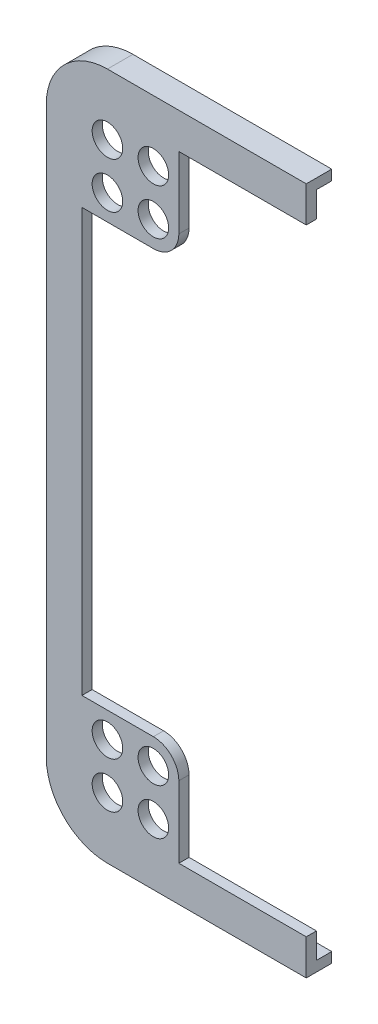
ISO-10303-21;
HEADER;
FILE_DESCRIPTION(('STEP AP214'),'2;1');
FILE_NAME('part.step','',(''),(''),'','','');
FILE_SCHEMA(('AUTOMOTIVE_DESIGN { 1 0 10303 214 1 1 1 1 }'));
ENDSEC;
DATA;
#1=APPLICATION_CONTEXT('core data for automotive mechanical design processes');
#2=APPLICATION_PROTOCOL_DEFINITION('international standard','automotive_design',2000,#1);
#3=PRODUCT_CONTEXT('',#1,'mechanical');
#4=PRODUCT('Part','Part','',(#3));
#5=PRODUCT_RELATED_PRODUCT_CATEGORY('part','',(#4));
#6=PRODUCT_DEFINITION_FORMATION('','',#4);
#7=PRODUCT_DEFINITION_CONTEXT('part definition',#1,'design');
#8=PRODUCT_DEFINITION('design','',#6,#7);
#9=PRODUCT_DEFINITION_SHAPE('','',#8);
#10=(LENGTH_UNIT() NAMED_UNIT(*) SI_UNIT(.MILLI.,.METRE.));
#11=(NAMED_UNIT(*) PLANE_ANGLE_UNIT() SI_UNIT($,.RADIAN.));
#12=(NAMED_UNIT(*) SI_UNIT($,.STERADIAN.) SOLID_ANGLE_UNIT());
#13=UNCERTAINTY_MEASURE_WITH_UNIT(LENGTH_MEASURE(1.E-05),#10,'distance_accuracy_value','');
#14=(GEOMETRIC_REPRESENTATION_CONTEXT(3) GLOBAL_UNCERTAINTY_ASSIGNED_CONTEXT((#13)) GLOBAL_UNIT_ASSIGNED_CONTEXT((#10,
#11,#12)) REPRESENTATION_CONTEXT('',''));
#15=CARTESIAN_POINT('',(0.,0.,0.));
#16=DIRECTION('',(0.,0.,1.));
#17=DIRECTION('',(1.,0.,0.));
#18=AXIS2_PLACEMENT_3D('',#15,#16,#17);
#19=CARTESIAN_POINT('',(0.,0.,0.));
#20=DIRECTION('',(0.,0.,1.));
#21=DIRECTION('',(1.,0.,0.));
#22=AXIS2_PLACEMENT_3D('',#19,#20,#21);
#23=PLANE('',#22);
#24=DIRECTION('',(1.,0.,0.));
#25=VECTOR('',#24,1.);
#26=CARTESIAN_POINT('',(4.41186441001223,3.28637455559292,0.));
#27=LINE('',#26,#25);
#28=CARTESIAN_POINT('',(16.4118644100122,3.28637455559292,0.));
#29=VERTEX_POINT('',#28);
#30=CARTESIAN_POINT('',(55.4222720500978,3.28637455559292,0.));
#31=VERTEX_POINT('',#30);
#32=EDGE_CURVE('E352',#29,#31,#27,.T.);
#33=ORIENTED_EDGE('',*,*,#32,.F.);
#34=CARTESIAN_POINT('',(16.4118644100122,15.2863745555929,0.));
#35=DIRECTION('',(0.,0.,1.));
#36=DIRECTION('',(1.,0.,0.));
#37=AXIS2_PLACEMENT_3D('',#34,#35,#36);
#38=CIRCLE('',#37,12.);
#39=CARTESIAN_POINT('',(4.41186441001222,15.2863745555929,0.));
#40=VERTEX_POINT('',#39);
#41=EDGE_CURVE('E383',#29,#40,#38,.F.);
#42=ORIENTED_EDGE('',*,*,#41,.T.);
#43=DIRECTION('',(0.,-1.,0.));
#44=VECTOR('',#43,1.);
#45=CARTESIAN_POINT('',(4.4118644100122,138.238694525702,0.));
#46=LINE('',#45,#44);
#47=CARTESIAN_POINT('',(4.4118644100122,126.238694525702,0.));
#48=VERTEX_POINT('',#47);
#49=EDGE_CURVE('E330',#48,#40,#46,.T.);
#50=ORIENTED_EDGE('',*,*,#49,.F.);
#51=CARTESIAN_POINT('',(16.4118644100122,126.238694525702,0.));
#52=DIRECTION('',(0.,0.,1.));
#53=DIRECTION('',(1.,0.,0.));
#54=AXIS2_PLACEMENT_3D('',#51,#52,#53);
#55=CIRCLE('',#54,12.);
#56=CARTESIAN_POINT('',(16.4118644100122,138.238694525702,0.));
#57=VERTEX_POINT('',#56);
#58=EDGE_CURVE('E380',#48,#57,#55,.F.);
#59=ORIENTED_EDGE('',*,*,#58,.T.);
#60=DIRECTION('',(-1.,0.,0.));
#61=VECTOR('',#60,1.);
#62=CARTESIAN_POINT('',(4.4118644100122,138.238694525702,0.));
#63=LINE('',#62,#61);
#64=CARTESIAN_POINT('',(55.4222720500978,138.238694525702,0.));
#65=VERTEX_POINT('',#64);
#66=EDGE_CURVE('E336',#65,#57,#63,.T.);
#67=ORIENTED_EDGE('',*,*,#66,.F.);
#68=DIRECTION('',(0.,1.,0.));
#69=VECTOR('',#68,1.);
#70=CARTESIAN_POINT('',(55.4222720500978,138.238694525702,0.));
#71=LINE('',#70,#69);
#72=CARTESIAN_POINT('',(55.4222720500978,136.238694525702,0.));
#73=VERTEX_POINT('',#72);
#74=EDGE_CURVE('E216',#73,#65,#71,.T.);
#75=ORIENTED_EDGE('',*,*,#74,.F.);
#76=DIRECTION('',(1.,0.,0.));
#77=VECTOR('',#76,1.);
#78=CARTESIAN_POINT('',(16.4118644100122,136.238694525702,0.));
#79=LINE('',#78,#77);
#80=CARTESIAN_POINT('',(16.4118644100122,136.238694525702,0.));
#81=VERTEX_POINT('',#80);
#82=EDGE_CURVE('E193',#81,#73,#79,.T.);
#83=ORIENTED_EDGE('',*,*,#82,.F.);
#84=CARTESIAN_POINT('',(16.4118644100122,126.238694525702,0.));
#85=DIRECTION('',(0.,0.,1.));
#86=DIRECTION('',(1.,0.,0.));
#87=AXIS2_PLACEMENT_3D('',#84,#85,#86);
#88=CIRCLE('',#87,10.);
#89=CARTESIAN_POINT('',(6.4118644100122,126.238694525702,0.));
#90=VERTEX_POINT('',#89);
#91=EDGE_CURVE('E200',#81,#90,#88,.T.);
#92=ORIENTED_EDGE('',*,*,#91,.T.);
#93=DIRECTION('',(0.,-1.,0.));
#94=VECTOR('',#93,1.);
#95=CARTESIAN_POINT('',(6.4118644100122,126.238694525702,0.));
#96=LINE('',#95,#94);
#97=CARTESIAN_POINT('',(6.41186441001221,15.286374555593,0.));
#98=VERTEX_POINT('',#97);
#99=EDGE_CURVE('E201',#90,#98,#96,.T.);
#100=ORIENTED_EDGE('',*,*,#99,.T.);
#101=CARTESIAN_POINT('',(16.4118644100122,15.2863745555929,0.));
#102=DIRECTION('',(0.,0.,1.));
#103=DIRECTION('',(1.,0.,0.));
#104=AXIS2_PLACEMENT_3D('',#101,#102,#103);
#105=CIRCLE('',#104,10.);
#106=CARTESIAN_POINT('',(16.4118644100123,5.28637455559292,0.));
#107=VERTEX_POINT('',#106);
#108=EDGE_CURVE('E236',#98,#107,#105,.T.);
#109=ORIENTED_EDGE('',*,*,#108,.T.);
#110=DIRECTION('',(1.,0.,0.));
#111=VECTOR('',#110,1.);
#112=CARTESIAN_POINT('',(16.4118644100123,5.28637455559292,0.));
#113=LINE('',#112,#111);
#114=CARTESIAN_POINT('',(55.4222720500978,5.28637455559292,0.));
#115=VERTEX_POINT('',#114);
#116=EDGE_CURVE('E231',#107,#115,#113,.T.);
#117=ORIENTED_EDGE('',*,*,#116,.T.);
#118=EDGE_CURVE('E355',#31,#115,#71,.T.);
#119=ORIENTED_EDGE('',*,*,#118,.F.);
#120=EDGE_LOOP('',(#33,#42,#50,#59,#67,#75,#83,#92,#100,#109,#117,#119));
#121=FACE_BOUND('',#120,.T.);
#122=ADVANCED_FACE('F40',(#121),#23,.F.);
#123=CARTESIAN_POINT('',(55.4222720500978,138.238694525702,5.));
#124=DIRECTION('',(-1.,0.,0.));
#125=DIRECTION('',(0.,-1.,0.));
#126=AXIS2_PLACEMENT_3D('',#123,#124,#125);
#127=PLANE('',#126);
#128=DIRECTION('',(0.,0.,1.));
#129=VECTOR('',#128,1.);
#130=CARTESIAN_POINT('',(55.4222720500978,131.238694525702,5.));
#131=LINE('',#130,#129);
#132=CARTESIAN_POINT('',(55.4222720500978,131.238694525702,3.));
#133=VERTEX_POINT('',#132);
#134=CARTESIAN_POINT('',(55.4222720500978,131.238694525702,5.));
#135=VERTEX_POINT('',#134);
#136=EDGE_CURVE('E327',#133,#135,#131,.T.);
#137=ORIENTED_EDGE('',*,*,#136,.F.);
#138=DIRECTION('',(0.,1.,0.));
#139=VECTOR('',#138,1.);
#140=CARTESIAN_POINT('',(55.4222720500978,138.238694525702,3.));
#141=LINE('',#140,#139);
#142=CARTESIAN_POINT('',(55.4222720500978,136.238694525702,3.));
#143=VERTEX_POINT('',#142);
#144=EDGE_CURVE('E279',#133,#143,#141,.T.);
#145=ORIENTED_EDGE('',*,*,#144,.T.);
#146=DIRECTION('',(0.,0.,-1.));
#147=VECTOR('',#146,1.);
#148=CARTESIAN_POINT('',(55.4222720500978,136.238694525702,5.));
#149=LINE('',#148,#147);
#150=EDGE_CURVE('E283',#143,#73,#149,.T.);
#151=ORIENTED_EDGE('',*,*,#150,.T.);
#152=ORIENTED_EDGE('',*,*,#74,.T.);
#153=DIRECTION('',(0.,0.,-1.));
#154=VECTOR('',#153,1.);
#155=CARTESIAN_POINT('',(55.4222720500978,138.238694525702,5.));
#156=LINE('',#155,#154);
#157=CARTESIAN_POINT('',(55.4222720500978,138.238694525702,5.));
#158=VERTEX_POINT('',#157);
#159=EDGE_CURVE('E348',#158,#65,#156,.T.);
#160=ORIENTED_EDGE('',*,*,#159,.F.);
#161=DIRECTION('',(0.,1.,0.));
#162=VECTOR('',#161,1.);
#163=CARTESIAN_POINT('',(55.4222720500978,138.238694525702,5.));
#164=LINE('',#163,#162);
#165=EDGE_CURVE('E339',#135,#158,#164,.T.);
#166=ORIENTED_EDGE('',*,*,#165,.F.);
#167=EDGE_LOOP('',(#137,#145,#151,#152,#160,#166));
#168=FACE_BOUND('',#167,.T.);
#169=ADVANCED_FACE('F511',(#168),#127,.F.);
#170=CARTESIAN_POINT('',(0.,0.,5.));
#171=DIRECTION('',(0.,0.,1.));
#172=DIRECTION('',(1.,0.,0.));
#173=AXIS2_PLACEMENT_3D('',#170,#171,#172);
#174=PLANE('',#173);
#175=CARTESIAN_POINT('',(16.4118644100122,117.228286885617,5.));
#176=DIRECTION('',(0.,0.,1.));
#177=DIRECTION('',(1.,0.,0.));
#178=AXIS2_PLACEMENT_3D('',#175,#176,#177);
#179=CIRCLE('',#178,3.);
#180=CARTESIAN_POINT('',(19.4118644100122,117.228286885617,5.));
#181=VERTEX_POINT('',#180);
#182=EDGE_CURVE('E786',#181,#181,#179,.T.);
#183=ORIENTED_EDGE('',*,*,#182,.F.);
#184=EDGE_LOOP('',(#183));
#185=FACE_BOUND('',#184,.T.);
#186=CARTESIAN_POINT('',(16.4118644100122,15.2863745555929,5.));
#187=DIRECTION('',(0.,0.,1.));
#188=DIRECTION('',(1.,0.,0.));
#189=AXIS2_PLACEMENT_3D('',#186,#187,#188);
#190=CIRCLE('',#189,3.);
#191=CARTESIAN_POINT('',(19.4118644100122,15.2863745555929,5.));
#192=VERTEX_POINT('',#191);
#193=EDGE_CURVE('E789',#192,#192,#190,.T.);
#194=ORIENTED_EDGE('',*,*,#193,.F.);
#195=EDGE_LOOP('',(#194));
#196=FACE_BOUND('',#195,.T.);
#197=CARTESIAN_POINT('',(25.4222720500978,15.2863745555929,5.));
#198=DIRECTION('',(0.,0.,1.));
#199=DIRECTION('',(1.,0.,0.));
#200=AXIS2_PLACEMENT_3D('',#197,#198,#199);
#201=CIRCLE('',#200,3.);
#202=CARTESIAN_POINT('',(28.4222720500978,15.2863745555929,5.));
#203=VERTEX_POINT('',#202);
#204=EDGE_CURVE('E778',#203,#203,#201,.T.);
#205=ORIENTED_EDGE('',*,*,#204,.F.);
#206=EDGE_LOOP('',(#205));
#207=FACE_BOUND('',#206,.T.);
#208=CARTESIAN_POINT('',(25.4222720500978,126.238694525702,5.));
#209=DIRECTION('',(0.,0.,1.));
#210=DIRECTION('',(1.,0.,0.));
#211=AXIS2_PLACEMENT_3D('',#208,#209,#210);
#212=CIRCLE('',#211,3.);
#213=CARTESIAN_POINT('',(28.4222720500978,126.238694525702,5.));
#214=VERTEX_POINT('',#213);
#215=EDGE_CURVE('E772',#214,#214,#212,.T.);
#216=ORIENTED_EDGE('',*,*,#215,.F.);
#217=EDGE_LOOP('',(#216));
#218=FACE_BOUND('',#217,.T.);
#219=CARTESIAN_POINT('',(16.4118644100122,126.238694525702,5.));
#220=DIRECTION('',(0.,0.,1.));
#221=DIRECTION('',(1.,0.,0.));
#222=AXIS2_PLACEMENT_3D('',#219,#220,#221);
#223=CIRCLE('',#222,3.);
#224=CARTESIAN_POINT('',(19.4118644100122,126.238694525702,5.));
#225=VERTEX_POINT('',#224);
#226=EDGE_CURVE('E761',#225,#225,#223,.T.);
#227=ORIENTED_EDGE('',*,*,#226,.F.);
#228=EDGE_LOOP('',(#227));
#229=FACE_BOUND('',#228,.T.);
#230=CARTESIAN_POINT('',(16.4118644100122,24.2967821956785,5.));
#231=DIRECTION('',(0.,0.,1.));
#232=DIRECTION('',(1.,0.,0.));
#233=AXIS2_PLACEMENT_3D('',#230,#231,#232);
#234=CIRCLE('',#233,3.);
#235=CARTESIAN_POINT('',(19.4118644100122,24.2967821956785,5.));
#236=VERTEX_POINT('',#235);
#237=EDGE_CURVE('E773',#236,#236,#234,.T.);
#238=ORIENTED_EDGE('',*,*,#237,.F.);
#239=EDGE_LOOP('',(#238));
#240=FACE_BOUND('',#239,.T.);
#241=CARTESIAN_POINT('',(25.4222720500978,24.2967821956785,5.));
#242=DIRECTION('',(0.,0.,1.));
#243=DIRECTION('',(1.,0.,0.));
#244=AXIS2_PLACEMENT_3D('',#241,#242,#243);
#245=CIRCLE('',#244,3.);
#246=CARTESIAN_POINT('',(28.4222720500978,24.2967821956785,5.));
#247=VERTEX_POINT('',#246);
#248=EDGE_CURVE('E780',#247,#247,#245,.T.);
#249=ORIENTED_EDGE('',*,*,#248,.F.);
#250=EDGE_LOOP('',(#249));
#251=FACE_BOUND('',#250,.T.);
#252=CARTESIAN_POINT('',(25.4222720500978,117.228286885617,5.));
#253=DIRECTION('',(0.,0.,1.));
#254=DIRECTION('',(1.,0.,0.));
#255=AXIS2_PLACEMENT_3D('',#252,#253,#254);
#256=CIRCLE('',#255,3.);
#257=CARTESIAN_POINT('',(28.4222720500978,117.228286885617,5.));
#258=VERTEX_POINT('',#257);
#259=EDGE_CURVE('E229',#258,#258,#256,.T.);
#260=ORIENTED_EDGE('',*,*,#259,.F.);
#261=EDGE_LOOP('',(#260));
#262=FACE_BOUND('',#261,.T.);
#263=DIRECTION('',(0.,1.,0.));
#264=VECTOR('',#263,1.);
#265=CARTESIAN_POINT('',(30.4222720500978,0.,5.));
#266=LINE('',#265,#264);
#267=CARTESIAN_POINT('',(30.4222720500978,10.2863745555929,5.));
#268=VERTEX_POINT('',#267);
#269=CARTESIAN_POINT('',(30.4222720500978,24.2967821956785,5.));
#270=VERTEX_POINT('',#269);
#271=EDGE_CURVE('E298',#268,#270,#266,.T.);
#272=ORIENTED_EDGE('',*,*,#271,.T.);
#273=CARTESIAN_POINT('',(25.4222720500978,24.2967821956785,5.));
#274=DIRECTION('',(0.,0.,1.));
#275=DIRECTION('',(1.,0.,0.));
#276=AXIS2_PLACEMENT_3D('',#273,#274,#275);
#277=CIRCLE('',#276,5.);
#278=CARTESIAN_POINT('',(25.4222720500978,29.2967821956785,5.));
#279=VERTEX_POINT('',#278);
#280=EDGE_CURVE('E440',#270,#279,#277,.T.);
#281=ORIENTED_EDGE('',*,*,#280,.T.);
#282=DIRECTION('',(1.,0.,0.));
#283=VECTOR('',#282,1.);
#284=CARTESIAN_POINT('',(0.,29.2967821956785,5.));
#285=LINE('',#284,#283);
#286=CARTESIAN_POINT('',(11.4118644100122,29.2967821956785,5.));
#287=VERTEX_POINT('',#286);
#288=EDGE_CURVE('E294',#287,#279,#285,.T.);
#289=ORIENTED_EDGE('',*,*,#288,.F.);
#290=DIRECTION('',(0.,1.,0.));
#291=VECTOR('',#290,1.);
#292=CARTESIAN_POINT('',(11.4118644100122,0.,5.));
#293=LINE('',#292,#291);
#294=CARTESIAN_POINT('',(11.4118644100122,112.228286885617,5.));
#295=VERTEX_POINT('',#294);
#296=EDGE_CURVE('E290',#287,#295,#293,.T.);
#297=ORIENTED_EDGE('',*,*,#296,.T.);
#298=DIRECTION('',(1.,0.,0.));
#299=VECTOR('',#298,1.);
#300=CARTESIAN_POINT('',(0.,112.228286885617,5.));
#301=LINE('',#300,#299);
#302=CARTESIAN_POINT('',(25.4222720500978,112.228286885617,5.));
#303=VERTEX_POINT('',#302);
#304=EDGE_CURVE('E286',#295,#303,#301,.T.);
#305=ORIENTED_EDGE('',*,*,#304,.T.);
#306=CARTESIAN_POINT('',(25.4222720500978,117.228286885617,5.));
#307=DIRECTION('',(0.,0.,1.));
#308=DIRECTION('',(1.,0.,0.));
#309=AXIS2_PLACEMENT_3D('',#306,#307,#308);
#310=CIRCLE('',#309,5.);
#311=CARTESIAN_POINT('',(30.4222720500978,117.228286885617,5.));
#312=VERTEX_POINT('',#311);
#313=EDGE_CURVE('E437',#303,#312,#310,.T.);
#314=ORIENTED_EDGE('',*,*,#313,.T.);
#315=CARTESIAN_POINT('',(30.4222720500978,131.238694525702,5.));
#316=VERTEX_POINT('',#315);
#317=EDGE_CURVE('E303',#312,#316,#266,.T.);
#318=ORIENTED_EDGE('',*,*,#317,.T.);
#319=DIRECTION('',(1.,0.,0.));
#320=VECTOR('',#319,1.);
#321=CARTESIAN_POINT('',(0.,131.238694525702,5.));
#322=LINE('',#321,#320);
#323=EDGE_CURVE('E307',#316,#135,#322,.T.);
#324=ORIENTED_EDGE('',*,*,#323,.T.);
#325=ORIENTED_EDGE('',*,*,#165,.T.);
#326=DIRECTION('',(-1.,0.,0.));
#327=VECTOR('',#326,1.);
#328=CARTESIAN_POINT('',(4.4118644100122,138.238694525702,5.));
#329=LINE('',#328,#327);
#330=CARTESIAN_POINT('',(16.4118644100122,138.238694525702,5.));
#331=VERTEX_POINT('',#330);
#332=EDGE_CURVE('E344',#158,#331,#329,.T.);
#333=ORIENTED_EDGE('',*,*,#332,.T.);
#334=CARTESIAN_POINT('',(16.4118644100122,126.238694525702,5.));
#335=DIRECTION('',(0.,0.,1.));
#336=DIRECTION('',(1.,0.,0.));
#337=AXIS2_PLACEMENT_3D('',#334,#335,#336);
#338=CIRCLE('',#337,12.);
#339=CARTESIAN_POINT('',(4.4118644100122,126.238694525702,5.));
#340=VERTEX_POINT('',#339);
#341=EDGE_CURVE('E393',#331,#340,#338,.T.);
#342=ORIENTED_EDGE('',*,*,#341,.T.);
#343=DIRECTION('',(0.,-1.,0.));
#344=VECTOR('',#343,1.);
#345=CARTESIAN_POINT('',(4.4118644100122,138.238694525702,5.));
#346=LINE('',#345,#344);
#347=CARTESIAN_POINT('',(4.41186441001222,15.2863745555929,5.));
#348=VERTEX_POINT('',#347);
#349=EDGE_CURVE('E331',#340,#348,#346,.T.);
#350=ORIENTED_EDGE('',*,*,#349,.T.);
#351=CARTESIAN_POINT('',(16.4118644100122,15.2863745555929,5.));
#352=DIRECTION('',(0.,0.,1.));
#353=DIRECTION('',(1.,0.,0.));
#354=AXIS2_PLACEMENT_3D('',#351,#352,#353);
#355=CIRCLE('',#354,12.);
#356=CARTESIAN_POINT('',(16.4118644100122,3.28637455559292,5.));
#357=VERTEX_POINT('',#356);
#358=EDGE_CURVE('E396',#348,#357,#355,.T.);
#359=ORIENTED_EDGE('',*,*,#358,.T.);
#360=DIRECTION('',(1.,0.,0.));
#361=VECTOR('',#360,1.);
#362=CARTESIAN_POINT('',(4.41186441001223,3.28637455559292,5.));
#363=LINE('',#362,#361);
#364=CARTESIAN_POINT('',(55.4222720500978,3.28637455559292,5.));
#365=VERTEX_POINT('',#364);
#366=EDGE_CURVE('E335',#357,#365,#363,.T.);
#367=ORIENTED_EDGE('',*,*,#366,.T.);
#368=CARTESIAN_POINT('',(55.4222720500978,10.286374555593,5.));
#369=VERTEX_POINT('',#368);
#370=EDGE_CURVE('E340',#365,#369,#164,.T.);
#371=ORIENTED_EDGE('',*,*,#370,.T.);
#372=DIRECTION('',(1.,0.,0.));
#373=VECTOR('',#372,1.);
#374=CARTESIAN_POINT('',(0.,10.2863745555929,5.));
#375=LINE('',#374,#373);
#376=EDGE_CURVE('E302',#268,#369,#375,.T.);
#377=ORIENTED_EDGE('',*,*,#376,.F.);
#378=EDGE_LOOP('',(#272,#281,#289,#297,#305,#314,#318,#324,#325,#333,#342,#350,#359,#367,#371,#377));
#379=FACE_BOUND('',#378,.T.);
#380=ADVANCED_FACE('F459',(#185,#196,#207,#218,#229,#240,#251,#262,#379),#174,.T.);
#381=CARTESIAN_POINT('',(4.4118644100122,138.238694525702,5.));
#382=DIRECTION('',(1.,0.,0.));
#383=DIRECTION('',(0.,1.,0.));
#384=AXIS2_PLACEMENT_3D('',#381,#382,#383);
#385=PLANE('',#384);
#386=ORIENTED_EDGE('',*,*,#49,.T.);
#387=DIRECTION('',(0.,0.,-1.));
#388=VECTOR('',#387,1.);
#389=CARTESIAN_POINT('',(4.41186441001222,15.2863745555929,5.));
#390=LINE('',#389,#388);
#391=EDGE_CURVE('E390',#40,#348,#390,.F.);
#392=ORIENTED_EDGE('',*,*,#391,.T.);
#393=ORIENTED_EDGE('',*,*,#349,.F.);
#394=DIRECTION('',(0.,0.,-1.));
#395=VECTOR('',#394,1.);
#396=CARTESIAN_POINT('',(4.4118644100122,126.238694525702,5.));
#397=LINE('',#396,#395);
#398=EDGE_CURVE('E386',#340,#48,#397,.T.);
#399=ORIENTED_EDGE('',*,*,#398,.T.);
#400=EDGE_LOOP('',(#386,#392,#393,#399));
#401=FACE_BOUND('',#400,.T.);
#402=ADVANCED_FACE('F529',(#401),#385,.F.);
#403=CARTESIAN_POINT('',(4.41186441001223,3.28637455559292,5.));
#404=DIRECTION('',(0.,1.,0.));
#405=DIRECTION('',(0.,0.,1.));
#406=AXIS2_PLACEMENT_3D('',#403,#404,#405);
#407=PLANE('',#406);
#408=ORIENTED_EDGE('',*,*,#366,.F.);
#409=DIRECTION('',(0.,0.,-1.));
#410=VECTOR('',#409,1.);
#411=CARTESIAN_POINT('',(16.4118644100122,3.28637455559292,5.));
#412=LINE('',#411,#410);
#413=EDGE_CURVE('E376',#357,#29,#412,.T.);
#414=ORIENTED_EDGE('',*,*,#413,.T.);
#415=ORIENTED_EDGE('',*,*,#32,.T.);
#416=DIRECTION('',(0.,0.,-1.));
#417=VECTOR('',#416,1.);
#418=CARTESIAN_POINT('',(55.4222720500978,3.28637455559292,5.));
#419=LINE('',#418,#417);
#420=EDGE_CURVE('E365',#365,#31,#419,.T.);
#421=ORIENTED_EDGE('',*,*,#420,.F.);
#422=EDGE_LOOP('',(#408,#414,#415,#421));
#423=FACE_BOUND('',#422,.T.);
#424=ADVANCED_FACE('F526',(#423),#407,.F.);
#425=DIRECTION('',(0.,0.,-1.));
#426=VECTOR('',#425,1.);
#427=CARTESIAN_POINT('',(55.4222720500978,5.28637455559292,5.));
#428=LINE('',#427,#426);
#429=CARTESIAN_POINT('',(55.4222720500978,5.28637455559292,3.));
#430=VERTEX_POINT('',#429);
#431=EDGE_CURVE('E373',#430,#115,#428,.T.);
#432=ORIENTED_EDGE('',*,*,#431,.F.);
#433=DIRECTION('',(0.,1.,0.));
#434=VECTOR('',#433,1.);
#435=CARTESIAN_POINT('',(55.4222720500978,138.238694525702,3.));
#436=LINE('',#435,#434);
#437=CARTESIAN_POINT('',(55.4222720500978,10.286374555593,3.));
#438=VERTEX_POINT('',#437);
#439=EDGE_CURVE('E269',#430,#438,#436,.T.);
#440=ORIENTED_EDGE('',*,*,#439,.T.);
#441=DIRECTION('',(0.,0.,1.));
#442=VECTOR('',#441,1.);
#443=CARTESIAN_POINT('',(55.4222720500978,10.286374555593,5.));
#444=LINE('',#443,#442);
#445=EDGE_CURVE('E315',#438,#369,#444,.T.);
#446=ORIENTED_EDGE('',*,*,#445,.T.);
#447=ORIENTED_EDGE('',*,*,#370,.F.);
#448=ORIENTED_EDGE('',*,*,#420,.T.);
#449=ORIENTED_EDGE('',*,*,#118,.T.);
#450=EDGE_LOOP('',(#432,#440,#446,#447,#448,#449));
#451=FACE_BOUND('',#450,.T.);
#452=ADVANCED_FACE('F487',(#451),#127,.F.);
#453=CARTESIAN_POINT('',(4.4118644100122,138.238694525702,5.));
#454=DIRECTION('',(0.,-1.,0.));
#455=DIRECTION('',(0.,0.,-1.));
#456=AXIS2_PLACEMENT_3D('',#453,#454,#455);
#457=PLANE('',#456);
#458=ORIENTED_EDGE('',*,*,#66,.T.);
#459=DIRECTION('',(0.,0.,-1.));
#460=VECTOR('',#459,1.);
#461=CARTESIAN_POINT('',(16.4118644100122,138.238694525702,5.));
#462=LINE('',#461,#460);
#463=EDGE_CURVE('E399',#57,#331,#462,.F.);
#464=ORIENTED_EDGE('',*,*,#463,.T.);
#465=ORIENTED_EDGE('',*,*,#332,.F.);
#466=ORIENTED_EDGE('',*,*,#159,.T.);
#467=EDGE_LOOP('',(#458,#464,#465,#466));
#468=FACE_BOUND('',#467,.T.);
#469=ADVANCED_FACE('F521',(#468),#457,.F.);
#470=CARTESIAN_POINT('',(0.,112.228286885617,-2.));
#471=DIRECTION('',(0.,-1.,0.));
#472=DIRECTION('',(1.,0.,0.));
#473=AXIS2_PLACEMENT_3D('',#470,#471,#472);
#474=PLANE('',#473);
#475=DIRECTION('',(-1.,0.,0.));
#476=VECTOR('',#475,1.);
#477=CARTESIAN_POINT('',(0.,112.228286885617,3.));
#478=LINE('',#477,#476);
#479=CARTESIAN_POINT('',(25.4222720500978,112.228286885617,3.));
#480=VERTEX_POINT('',#479);
#481=CARTESIAN_POINT('',(11.4118644100122,112.228286885617,3.));
#482=VERTEX_POINT('',#481);
#483=EDGE_CURVE('E266',#480,#482,#478,.T.);
#484=ORIENTED_EDGE('',*,*,#483,.F.);
#485=DIRECTION('',(0.,0.,1.));
#486=VECTOR('',#485,1.);
#487=CARTESIAN_POINT('',(25.4222720500978,112.228286885617,-2.));
#488=LINE('',#487,#486);
#489=EDGE_CURVE('E49',#480,#303,#488,.T.);
#490=ORIENTED_EDGE('',*,*,#489,.T.);
#491=ORIENTED_EDGE('',*,*,#304,.F.);
#492=DIRECTION('',(0.,0.,1.));
#493=VECTOR('',#492,1.);
#494=CARTESIAN_POINT('',(11.4118644100122,112.228286885617,-2.));
#495=LINE('',#494,#493);
#496=EDGE_CURVE('E322',#482,#295,#495,.T.);
#497=ORIENTED_EDGE('',*,*,#496,.F.);
#498=EDGE_LOOP('',(#484,#490,#491,#497));
#499=FACE_BOUND('',#498,.T.);
#500=ADVANCED_FACE('F455',(#499),#474,.T.);
#501=CARTESIAN_POINT('',(30.4222720500978,0.,-2.));
#502=DIRECTION('',(1.,0.,0.));
#503=DIRECTION('',(0.,0.,-1.));
#504=AXIS2_PLACEMENT_3D('',#501,#502,#503);
#505=PLANE('',#504);
#506=ORIENTED_EDGE('',*,*,#317,.F.);
#507=DIRECTION('',(0.,0.,1.));
#508=VECTOR('',#507,1.);
#509=CARTESIAN_POINT('',(30.4222720500978,117.228286885617,-2.));
#510=LINE('',#509,#508);
#511=CARTESIAN_POINT('',(30.4222720500978,117.228286885617,3.));
#512=VERTEX_POINT('',#511);
#513=EDGE_CURVE('E12',#312,#512,#510,.F.);
#514=ORIENTED_EDGE('',*,*,#513,.T.);
#515=DIRECTION('',(0.,-1.,0.));
#516=VECTOR('',#515,1.);
#517=CARTESIAN_POINT('',(30.4222720500978,0.,3.));
#518=LINE('',#517,#516);
#519=CARTESIAN_POINT('',(30.4222720500978,131.238694525702,3.));
#520=VERTEX_POINT('',#519);
#521=EDGE_CURVE('E273',#520,#512,#518,.T.);
#522=ORIENTED_EDGE('',*,*,#521,.F.);
#523=DIRECTION('',(0.,0.,1.));
#524=VECTOR('',#523,1.);
#525=CARTESIAN_POINT('',(30.4222720500978,131.238694525702,-2.));
#526=LINE('',#525,#524);
#527=EDGE_CURVE('E311',#520,#316,#526,.T.);
#528=ORIENTED_EDGE('',*,*,#527,.T.);
#529=EDGE_LOOP('',(#506,#514,#522,#528));
#530=FACE_BOUND('',#529,.T.);
#531=ADVANCED_FACE('F594',(#530),#505,.T.);
#532=CARTESIAN_POINT('',(0.,131.238694525702,-2.));
#533=DIRECTION('',(0.,-1.,0.));
#534=DIRECTION('',(0.,0.,-1.));
#535=AXIS2_PLACEMENT_3D('',#532,#533,#534);
#536=PLANE('',#535);
#537=DIRECTION('',(-1.,0.,0.));
#538=VECTOR('',#537,1.);
#539=CARTESIAN_POINT('',(0.,131.238694525702,3.));
#540=LINE('',#539,#538);
#541=EDGE_CURVE('E276',#133,#520,#540,.T.);
#542=ORIENTED_EDGE('',*,*,#541,.F.);
#543=ORIENTED_EDGE('',*,*,#136,.T.);
#544=ORIENTED_EDGE('',*,*,#323,.F.);
#545=ORIENTED_EDGE('',*,*,#527,.F.);
#546=EDGE_LOOP('',(#542,#543,#544,#545));
#547=FACE_BOUND('',#546,.T.);
#548=ADVANCED_FACE('F597',(#547),#536,.T.);
#549=CARTESIAN_POINT('',(0.,10.2863745555929,-2.));
#550=DIRECTION('',(0.,-1.,0.));
#551=DIRECTION('',(1.,0.,0.));
#552=AXIS2_PLACEMENT_3D('',#549,#550,#551);
#553=PLANE('',#552);
#554=ORIENTED_EDGE('',*,*,#445,.F.);
#555=DIRECTION('',(-1.,0.,0.));
#556=VECTOR('',#555,1.);
#557=CARTESIAN_POINT('',(0.,10.2863745555929,3.));
#558=LINE('',#557,#556);
#559=CARTESIAN_POINT('',(30.4222720500978,10.2863745555929,3.));
#560=VERTEX_POINT('',#559);
#561=EDGE_CURVE('E262',#438,#560,#558,.T.);
#562=ORIENTED_EDGE('',*,*,#561,.T.);
#563=DIRECTION('',(0.,0.,1.));
#564=VECTOR('',#563,1.);
#565=CARTESIAN_POINT('',(30.4222720500978,10.2863745555929,-2.));
#566=LINE('',#565,#564);
#567=EDGE_CURVE('E316',#560,#268,#566,.T.);
#568=ORIENTED_EDGE('',*,*,#567,.T.);
#569=ORIENTED_EDGE('',*,*,#376,.T.);
#570=EDGE_LOOP('',(#554,#562,#568,#569));
#571=FACE_BOUND('',#570,.T.);
#572=ADVANCED_FACE('F483',(#571),#553,.F.);
#573=DIRECTION('',(0.,-1.,0.));
#574=VECTOR('',#573,1.);
#575=CARTESIAN_POINT('',(30.4222720500978,0.,3.));
#576=LINE('',#575,#574);
#577=CARTESIAN_POINT('',(30.4222720500978,24.2967821956785,3.));
#578=VERTEX_POINT('',#577);
#579=EDGE_CURVE('E259',#578,#560,#576,.T.);
#580=ORIENTED_EDGE('',*,*,#579,.F.);
#581=DIRECTION('',(0.,0.,1.));
#582=VECTOR('',#581,1.);
#583=CARTESIAN_POINT('',(30.4222720500978,24.2967821956785,5.));
#584=LINE('',#583,#582);
#585=EDGE_CURVE('E402',#578,#270,#584,.T.);
#586=ORIENTED_EDGE('',*,*,#585,.T.);
#587=ORIENTED_EDGE('',*,*,#271,.F.);
#588=ORIENTED_EDGE('',*,*,#567,.F.);
#589=EDGE_LOOP('',(#580,#586,#587,#588));
#590=FACE_BOUND('',#589,.T.);
#591=ADVANCED_FACE('F477',(#590),#505,.T.);
#592=CARTESIAN_POINT('',(0.,29.2967821956785,-2.));
#593=DIRECTION('',(0.,-1.,0.));
#594=DIRECTION('',(1.,0.,0.));
#595=AXIS2_PLACEMENT_3D('',#592,#593,#594);
#596=PLANE('',#595);
#597=ORIENTED_EDGE('',*,*,#288,.T.);
#598=DIRECTION('',(0.,0.,1.));
#599=VECTOR('',#598,1.);
#600=CARTESIAN_POINT('',(25.4222720500978,29.2967821956785,3.));
#601=LINE('',#600,#599);
#602=CARTESIAN_POINT('',(25.4222720500978,29.2967821956785,3.));
#603=VERTEX_POINT('',#602);
#604=EDGE_CURVE('E443',#279,#603,#601,.F.);
#605=ORIENTED_EDGE('',*,*,#604,.T.);
#606=DIRECTION('',(-1.,0.,0.));
#607=VECTOR('',#606,1.);
#608=CARTESIAN_POINT('',(0.,29.2967821956785,3.));
#609=LINE('',#608,#607);
#610=CARTESIAN_POINT('',(11.4118644100122,29.2967821956785,3.));
#611=VERTEX_POINT('',#610);
#612=EDGE_CURVE('E211',#603,#611,#609,.T.);
#613=ORIENTED_EDGE('',*,*,#612,.T.);
#614=DIRECTION('',(0.,0.,1.));
#615=VECTOR('',#614,1.);
#616=CARTESIAN_POINT('',(11.4118644100122,29.2967821956785,-2.));
#617=LINE('',#616,#615);
#618=EDGE_CURVE('E319',#611,#287,#617,.T.);
#619=ORIENTED_EDGE('',*,*,#618,.T.);
#620=EDGE_LOOP('',(#597,#605,#613,#619));
#621=FACE_BOUND('',#620,.T.);
#622=ADVANCED_FACE('F603',(#621),#596,.F.);
#623=CARTESIAN_POINT('',(11.4118644100122,0.,-2.));
#624=DIRECTION('',(1.,0.,0.));
#625=DIRECTION('',(0.,0.,-1.));
#626=AXIS2_PLACEMENT_3D('',#623,#624,#625);
#627=PLANE('',#626);
#628=DIRECTION('',(0.,-1.,0.));
#629=VECTOR('',#628,1.);
#630=CARTESIAN_POINT('',(11.4118644100122,0.,3.));
#631=LINE('',#630,#629);
#632=EDGE_CURVE('E369',#482,#611,#631,.T.);
#633=ORIENTED_EDGE('',*,*,#632,.F.);
#634=ORIENTED_EDGE('',*,*,#496,.T.);
#635=ORIENTED_EDGE('',*,*,#296,.F.);
#636=ORIENTED_EDGE('',*,*,#618,.F.);
#637=EDGE_LOOP('',(#633,#634,#635,#636));
#638=FACE_BOUND('',#637,.T.);
#639=ADVANCED_FACE('F465',(#638),#627,.T.);
#640=CARTESIAN_POINT('',(16.4118644100122,136.238694525702,303.064310096041));
#641=DIRECTION('',(0.,1.,0.));
#642=DIRECTION('',(0.,0.,1.));
#643=AXIS2_PLACEMENT_3D('',#640,#641,#642);
#644=PLANE('',#643);
#645=DIRECTION('',(1.,0.,0.));
#646=VECTOR('',#645,1.);
#647=CARTESIAN_POINT('',(16.4118644100122,136.238694525702,3.));
#648=LINE('',#647,#646);
#649=CARTESIAN_POINT('',(16.4118644100122,136.238694525702,3.));
#650=VERTEX_POINT('',#649);
#651=EDGE_CURVE('E196',#650,#143,#648,.T.);
#652=ORIENTED_EDGE('',*,*,#651,.F.);
#653=DIRECTION('',(0.,0.,-1.));
#654=VECTOR('',#653,1.);
#655=CARTESIAN_POINT('',(16.4118644100122,136.238694525702,303.064310096041));
#656=LINE('',#655,#654);
#657=EDGE_CURVE('E189',#650,#81,#656,.T.);
#658=ORIENTED_EDGE('',*,*,#657,.T.);
#659=ORIENTED_EDGE('',*,*,#82,.T.);
#660=ORIENTED_EDGE('',*,*,#150,.F.);
#661=EDGE_LOOP('',(#652,#658,#659,#660));
#662=FACE_BOUND('',#661,.T.);
#663=ADVANCED_FACE('F191',(#662),#644,.F.);
#664=CARTESIAN_POINT('',(16.4118644100123,5.28637455559292,303.064310096041));
#665=DIRECTION('',(0.,1.,0.));
#666=DIRECTION('',(0.,0.,1.));
#667=AXIS2_PLACEMENT_3D('',#664,#665,#666);
#668=PLANE('',#667);
#669=ORIENTED_EDGE('',*,*,#431,.T.);
#670=ORIENTED_EDGE('',*,*,#116,.F.);
#671=DIRECTION('',(0.,0.,-1.));
#672=VECTOR('',#671,1.);
#673=CARTESIAN_POINT('',(16.4118644100123,5.28637455559292,303.064310096041));
#674=LINE('',#673,#672);
#675=CARTESIAN_POINT('',(16.4118644100123,5.28637455559292,3.));
#676=VERTEX_POINT('',#675);
#677=EDGE_CURVE('E222',#676,#107,#674,.T.);
#678=ORIENTED_EDGE('',*,*,#677,.F.);
#679=DIRECTION('',(1.,0.,0.));
#680=VECTOR('',#679,1.);
#681=CARTESIAN_POINT('',(16.4118644100123,5.28637455559292,3.));
#682=LINE('',#681,#680);
#683=EDGE_CURVE('E218',#676,#430,#682,.T.);
#684=ORIENTED_EDGE('',*,*,#683,.T.);
#685=EDGE_LOOP('',(#669,#670,#678,#684));
#686=FACE_BOUND('',#685,.T.);
#687=ADVANCED_FACE('F491',(#686),#668,.T.);
#688=CARTESIAN_POINT('',(0.,0.,3.));
#689=DIRECTION('',(0.,0.,1.));
#690=DIRECTION('',(1.,0.,0.));
#691=AXIS2_PLACEMENT_3D('',#688,#689,#690);
#692=PLANE('',#691);
#693=CARTESIAN_POINT('',(16.4118644100122,117.228286885617,3.));
#694=DIRECTION('',(0.,0.,1.));
#695=DIRECTION('',(1.,0.,0.));
#696=AXIS2_PLACEMENT_3D('',#693,#694,#695);
#697=CIRCLE('',#696,3.);
#698=CARTESIAN_POINT('',(19.4118644100122,117.228286885617,3.));
#699=VERTEX_POINT('',#698);
#700=EDGE_CURVE('E246',#699,#699,#697,.F.);
#701=ORIENTED_EDGE('',*,*,#700,.F.);
#702=EDGE_LOOP('',(#701));
#703=FACE_BOUND('',#702,.T.);
#704=CARTESIAN_POINT('',(16.4118644100122,15.2863745555929,3.));
#705=DIRECTION('',(0.,0.,1.));
#706=DIRECTION('',(1.,0.,0.));
#707=AXIS2_PLACEMENT_3D('',#704,#705,#706);
#708=CIRCLE('',#707,3.);
#709=CARTESIAN_POINT('',(19.4118644100122,15.2863745555929,3.));
#710=VERTEX_POINT('',#709);
#711=EDGE_CURVE('E427',#710,#710,#708,.F.);
#712=ORIENTED_EDGE('',*,*,#711,.F.);
#713=EDGE_LOOP('',(#712));
#714=FACE_BOUND('',#713,.T.);
#715=CARTESIAN_POINT('',(25.4222720500978,15.2863745555929,3.));
#716=DIRECTION('',(0.,0.,1.));
#717=DIRECTION('',(1.,0.,0.));
#718=AXIS2_PLACEMENT_3D('',#715,#716,#717);
#719=CIRCLE('',#718,3.);
#720=CARTESIAN_POINT('',(28.4222720500978,15.2863745555929,3.));
#721=VERTEX_POINT('',#720);
#722=EDGE_CURVE('E423',#721,#721,#719,.F.);
#723=ORIENTED_EDGE('',*,*,#722,.F.);
#724=EDGE_LOOP('',(#723));
#725=FACE_BOUND('',#724,.T.);
#726=CARTESIAN_POINT('',(25.4222720500978,126.238694525702,3.));
#727=DIRECTION('',(0.,0.,1.));
#728=DIRECTION('',(1.,0.,0.));
#729=AXIS2_PLACEMENT_3D('',#726,#727,#728);
#730=CIRCLE('',#729,3.);
#731=CARTESIAN_POINT('',(28.4222720500978,126.238694525702,3.));
#732=VERTEX_POINT('',#731);
#733=EDGE_CURVE('E419',#732,#732,#730,.F.);
#734=ORIENTED_EDGE('',*,*,#733,.F.);
#735=EDGE_LOOP('',(#734));
#736=FACE_BOUND('',#735,.T.);
#737=CARTESIAN_POINT('',(16.4118644100122,126.238694525702,3.));
#738=DIRECTION('',(0.,0.,1.));
#739=DIRECTION('',(1.,0.,0.));
#740=AXIS2_PLACEMENT_3D('',#737,#738,#739);
#741=CIRCLE('',#740,3.);
#742=CARTESIAN_POINT('',(19.4118644100122,126.238694525702,3.));
#743=VERTEX_POINT('',#742);
#744=EDGE_CURVE('E415',#743,#743,#741,.F.);
#745=ORIENTED_EDGE('',*,*,#744,.F.);
#746=EDGE_LOOP('',(#745));
#747=FACE_BOUND('',#746,.T.);
#748=CARTESIAN_POINT('',(16.4118644100122,24.2967821956785,3.));
#749=DIRECTION('',(0.,0.,1.));
#750=DIRECTION('',(1.,0.,0.));
#751=AXIS2_PLACEMENT_3D('',#748,#749,#750);
#752=CIRCLE('',#751,3.);
#753=CARTESIAN_POINT('',(19.4118644100122,24.2967821956785,3.));
#754=VERTEX_POINT('',#753);
#755=EDGE_CURVE('E411',#754,#754,#752,.F.);
#756=ORIENTED_EDGE('',*,*,#755,.F.);
#757=EDGE_LOOP('',(#756));
#758=FACE_BOUND('',#757,.T.);
#759=CARTESIAN_POINT('',(25.4222720500978,24.2967821956785,3.));
#760=DIRECTION('',(0.,0.,1.));
#761=DIRECTION('',(1.,0.,0.));
#762=AXIS2_PLACEMENT_3D('',#759,#760,#761);
#763=CIRCLE('',#762,3.);
#764=CARTESIAN_POINT('',(28.4222720500978,24.2967821956785,3.));
#765=VERTEX_POINT('',#764);
#766=EDGE_CURVE('E407',#765,#765,#763,.F.);
#767=ORIENTED_EDGE('',*,*,#766,.F.);
#768=EDGE_LOOP('',(#767));
#769=FACE_BOUND('',#768,.T.);
#770=CARTESIAN_POINT('',(25.4222720500978,117.228286885617,3.));
#771=DIRECTION('',(0.,0.,1.));
#772=DIRECTION('',(1.,0.,0.));
#773=AXIS2_PLACEMENT_3D('',#770,#771,#772);
#774=CIRCLE('',#773,3.);
#775=CARTESIAN_POINT('',(28.4222720500978,117.228286885617,3.));
#776=VERTEX_POINT('',#775);
#777=EDGE_CURVE('E403',#776,#776,#774,.F.);
#778=ORIENTED_EDGE('',*,*,#777,.F.);
#779=EDGE_LOOP('',(#778));
#780=FACE_BOUND('',#779,.T.);
#781=ORIENTED_EDGE('',*,*,#612,.F.);
#782=CARTESIAN_POINT('',(25.4222720500978,24.2967821956785,3.));
#783=DIRECTION('',(0.,0.,1.));
#784=DIRECTION('',(1.,0.,0.));
#785=AXIS2_PLACEMENT_3D('',#782,#783,#784);
#786=CIRCLE('',#785,5.);
#787=EDGE_CURVE('E448',#603,#578,#786,.F.);
#788=ORIENTED_EDGE('',*,*,#787,.T.);
#789=ORIENTED_EDGE('',*,*,#579,.T.);
#790=ORIENTED_EDGE('',*,*,#561,.F.);
#791=ORIENTED_EDGE('',*,*,#439,.F.);
#792=ORIENTED_EDGE('',*,*,#683,.F.);
#793=CARTESIAN_POINT('',(16.4118644100122,15.2863745555929,3.));
#794=DIRECTION('',(0.,0.,1.));
#795=DIRECTION('',(1.,0.,0.));
#796=AXIS2_PLACEMENT_3D('',#793,#794,#795);
#797=CIRCLE('',#796,10.);
#798=CARTESIAN_POINT('',(6.41186441001221,15.286374555593,3.));
#799=VERTEX_POINT('',#798);
#800=EDGE_CURVE('E225',#799,#676,#797,.T.);
#801=ORIENTED_EDGE('',*,*,#800,.F.);
#802=DIRECTION('',(0.,-1.,0.));
#803=VECTOR('',#802,1.);
#804=CARTESIAN_POINT('',(6.4118644100122,126.238694525702,3.));
#805=LINE('',#804,#803);
#806=CARTESIAN_POINT('',(6.4118644100122,126.238694525702,3.));
#807=VERTEX_POINT('',#806);
#808=EDGE_CURVE('E245',#807,#799,#805,.T.);
#809=ORIENTED_EDGE('',*,*,#808,.F.);
#810=CARTESIAN_POINT('',(16.4118644100122,126.238694525702,3.));
#811=DIRECTION('',(0.,0.,1.));
#812=DIRECTION('',(1.,0.,0.));
#813=AXIS2_PLACEMENT_3D('',#810,#811,#812);
#814=CIRCLE('',#813,10.);
#815=EDGE_CURVE('E242',#650,#807,#814,.T.);
#816=ORIENTED_EDGE('',*,*,#815,.F.);
#817=ORIENTED_EDGE('',*,*,#651,.T.);
#818=ORIENTED_EDGE('',*,*,#144,.F.);
#819=ORIENTED_EDGE('',*,*,#541,.T.);
#820=ORIENTED_EDGE('',*,*,#521,.T.);
#821=CARTESIAN_POINT('',(25.4222720500978,117.228286885617,3.));
#822=DIRECTION('',(0.,0.,1.));
#823=DIRECTION('',(1.,0.,0.));
#824=AXIS2_PLACEMENT_3D('',#821,#822,#823);
#825=CIRCLE('',#824,5.);
#826=EDGE_CURVE('E56',#512,#480,#825,.F.);
#827=ORIENTED_EDGE('',*,*,#826,.T.);
#828=ORIENTED_EDGE('',*,*,#483,.T.);
#829=ORIENTED_EDGE('',*,*,#632,.T.);
#830=EDGE_LOOP('',(#781,#788,#789,#790,#791,#792,#801,#809,#816,#817,#818,#819,#820,#827,#828,#829));
#831=FACE_BOUND('',#830,.T.);
#832=ADVANCED_FACE('F467',(#703,#714,#725,#736,#747,#758,#769,#780,#831),#692,.F.);
#833=CARTESIAN_POINT('',(16.4118644100122,15.2863745555929,303.064310096041));
#834=DIRECTION('',(0.,0.,-1.));
#835=DIRECTION('',(-1.,0.,0.));
#836=AXIS2_PLACEMENT_3D('',#833,#834,#835);
#837=CYLINDRICAL_SURFACE('',#836,10.);
#838=ORIENTED_EDGE('',*,*,#800,.T.);
#839=ORIENTED_EDGE('',*,*,#677,.T.);
#840=ORIENTED_EDGE('',*,*,#108,.F.);
#841=DIRECTION('',(0.,0.,-1.));
#842=VECTOR('',#841,1.);
#843=CARTESIAN_POINT('',(6.41186441001221,15.286374555593,303.064310096041));
#844=LINE('',#843,#842);
#845=EDGE_CURVE('E235',#799,#98,#844,.T.);
#846=ORIENTED_EDGE('',*,*,#845,.F.);
#847=EDGE_LOOP('',(#838,#839,#840,#846));
#848=FACE_BOUND('',#847,.T.);
#849=ADVANCED_FACE('F496',(#848),#837,.F.);
#850=CARTESIAN_POINT('',(6.4118644100122,126.238694525702,303.064310096041));
#851=DIRECTION('',(1.,0.,0.));
#852=DIRECTION('',(0.,1.,0.));
#853=AXIS2_PLACEMENT_3D('',#850,#851,#852);
#854=PLANE('',#853);
#855=ORIENTED_EDGE('',*,*,#808,.T.);
#856=ORIENTED_EDGE('',*,*,#845,.T.);
#857=ORIENTED_EDGE('',*,*,#99,.F.);
#858=DIRECTION('',(0.,0.,-1.));
#859=VECTOR('',#858,1.);
#860=CARTESIAN_POINT('',(6.4118644100122,126.238694525702,303.064310096041));
#861=LINE('',#860,#859);
#862=EDGE_CURVE('E206',#807,#90,#861,.T.);
#863=ORIENTED_EDGE('',*,*,#862,.F.);
#864=EDGE_LOOP('',(#855,#856,#857,#863));
#865=FACE_BOUND('',#864,.T.);
#866=ADVANCED_FACE('F500',(#865),#854,.T.);
#867=CARTESIAN_POINT('',(16.4118644100122,126.238694525702,303.064310096041));
#868=DIRECTION('',(0.,0.,-1.));
#869=DIRECTION('',(-1.,0.,0.));
#870=AXIS2_PLACEMENT_3D('',#867,#868,#869);
#871=CYLINDRICAL_SURFACE('',#870,10.);
#872=ORIENTED_EDGE('',*,*,#815,.T.);
#873=ORIENTED_EDGE('',*,*,#862,.T.);
#874=ORIENTED_EDGE('',*,*,#91,.F.);
#875=ORIENTED_EDGE('',*,*,#657,.F.);
#876=EDGE_LOOP('',(#872,#873,#874,#875));
#877=FACE_BOUND('',#876,.T.);
#878=ADVANCED_FACE('F204',(#877),#871,.F.);
#879=CARTESIAN_POINT('',(16.4118644100122,15.2863745555929,5.));
#880=DIRECTION('',(0.,0.,-1.));
#881=DIRECTION('',(-1.,0.,0.));
#882=AXIS2_PLACEMENT_3D('',#879,#880,#881);
#883=CYLINDRICAL_SURFACE('',#882,12.);
#884=ORIENTED_EDGE('',*,*,#358,.F.);
#885=ORIENTED_EDGE('',*,*,#391,.F.);
#886=ORIENTED_EDGE('',*,*,#41,.F.);
#887=ORIENTED_EDGE('',*,*,#413,.F.);
#888=EDGE_LOOP('',(#884,#885,#886,#887));
#889=FACE_BOUND('',#888,.T.);
#890=ADVANCED_FACE('F507',(#889),#883,.T.);
#891=CARTESIAN_POINT('',(16.4118644100122,126.238694525702,5.));
#892=DIRECTION('',(0.,0.,-1.));
#893=DIRECTION('',(-1.,0.,0.));
#894=AXIS2_PLACEMENT_3D('',#891,#892,#893);
#895=CYLINDRICAL_SURFACE('',#894,12.);
#896=ORIENTED_EDGE('',*,*,#341,.F.);
#897=ORIENTED_EDGE('',*,*,#463,.F.);
#898=ORIENTED_EDGE('',*,*,#58,.F.);
#899=ORIENTED_EDGE('',*,*,#398,.F.);
#900=EDGE_LOOP('',(#896,#897,#898,#899));
#901=FACE_BOUND('',#900,.T.);
#902=ADVANCED_FACE('F536',(#901),#895,.T.);
#903=CARTESIAN_POINT('',(25.4222720500978,117.228286885617,5.));
#904=DIRECTION('',(0.,0.,-1.));
#905=DIRECTION('',(-1.,0.,0.));
#906=AXIS2_PLACEMENT_3D('',#903,#904,#905);
#907=CYLINDRICAL_SURFACE('',#906,3.);
#908=ORIENTED_EDGE('',*,*,#259,.T.);
#909=EDGE_LOOP('',(#908));
#910=FACE_BOUND('',#909,.T.);
#911=ORIENTED_EDGE('',*,*,#777,.T.);
#912=EDGE_LOOP('',(#911));
#913=FACE_BOUND('',#912,.T.);
#914=ADVANCED_FACE('F539',(#910,#913),#907,.F.);
#915=CARTESIAN_POINT('',(25.4222720500978,24.2967821956785,5.));
#916=DIRECTION('',(0.,0.,-1.));
#917=DIRECTION('',(-1.,0.,0.));
#918=AXIS2_PLACEMENT_3D('',#915,#916,#917);
#919=CYLINDRICAL_SURFACE('',#918,3.);
#920=ORIENTED_EDGE('',*,*,#248,.T.);
#921=EDGE_LOOP('',(#920));
#922=FACE_BOUND('',#921,.T.);
#923=ORIENTED_EDGE('',*,*,#766,.T.);
#924=EDGE_LOOP('',(#923));
#925=FACE_BOUND('',#924,.T.);
#926=ADVANCED_FACE('F559',(#922,#925),#919,.F.);
#927=CARTESIAN_POINT('',(16.4118644100122,24.2967821956785,5.));
#928=DIRECTION('',(0.,0.,-1.));
#929=DIRECTION('',(-1.,0.,0.));
#930=AXIS2_PLACEMENT_3D('',#927,#928,#929);
#931=CYLINDRICAL_SURFACE('',#930,3.);
#932=ORIENTED_EDGE('',*,*,#237,.T.);
#933=EDGE_LOOP('',(#932));
#934=FACE_BOUND('',#933,.T.);
#935=ORIENTED_EDGE('',*,*,#755,.T.);
#936=EDGE_LOOP('',(#935));
#937=FACE_BOUND('',#936,.T.);
#938=ADVANCED_FACE('F575',(#934,#937),#931,.F.);
#939=CARTESIAN_POINT('',(16.4118644100122,126.238694525702,5.));
#940=DIRECTION('',(0.,0.,-1.));
#941=DIRECTION('',(-1.,0.,0.));
#942=AXIS2_PLACEMENT_3D('',#939,#940,#941);
#943=CYLINDRICAL_SURFACE('',#942,3.);
#944=ORIENTED_EDGE('',*,*,#226,.T.);
#945=EDGE_LOOP('',(#944));
#946=FACE_BOUND('',#945,.T.);
#947=ORIENTED_EDGE('',*,*,#744,.T.);
#948=EDGE_LOOP('',(#947));
#949=FACE_BOUND('',#948,.T.);
#950=ADVANCED_FACE('F568',(#946,#949),#943,.F.);
#951=CARTESIAN_POINT('',(25.4222720500978,126.238694525702,5.));
#952=DIRECTION('',(0.,0.,-1.));
#953=DIRECTION('',(-1.,0.,0.));
#954=AXIS2_PLACEMENT_3D('',#951,#952,#953);
#955=CYLINDRICAL_SURFACE('',#954,3.);
#956=ORIENTED_EDGE('',*,*,#215,.T.);
#957=EDGE_LOOP('',(#956));
#958=FACE_BOUND('',#957,.T.);
#959=ORIENTED_EDGE('',*,*,#733,.T.);
#960=EDGE_LOOP('',(#959));
#961=FACE_BOUND('',#960,.T.);
#962=ADVANCED_FACE('F564',(#958,#961),#955,.F.);
#963=CARTESIAN_POINT('',(25.4222720500978,15.2863745555929,5.));
#964=DIRECTION('',(0.,0.,-1.));
#965=DIRECTION('',(-1.,0.,0.));
#966=AXIS2_PLACEMENT_3D('',#963,#964,#965);
#967=CYLINDRICAL_SURFACE('',#966,3.);
#968=ORIENTED_EDGE('',*,*,#204,.T.);
#969=EDGE_LOOP('',(#968));
#970=FACE_BOUND('',#969,.T.);
#971=ORIENTED_EDGE('',*,*,#722,.T.);
#972=EDGE_LOOP('',(#971));
#973=FACE_BOUND('',#972,.T.);
#974=ADVANCED_FACE('F553',(#970,#973),#967,.F.);
#975=CARTESIAN_POINT('',(16.4118644100122,15.2863745555929,5.));
#976=DIRECTION('',(0.,0.,-1.));
#977=DIRECTION('',(-1.,0.,0.));
#978=AXIS2_PLACEMENT_3D('',#975,#976,#977);
#979=CYLINDRICAL_SURFACE('',#978,3.);
#980=ORIENTED_EDGE('',*,*,#193,.T.);
#981=EDGE_LOOP('',(#980));
#982=FACE_BOUND('',#981,.T.);
#983=ORIENTED_EDGE('',*,*,#711,.T.);
#984=EDGE_LOOP('',(#983));
#985=FACE_BOUND('',#984,.T.);
#986=ADVANCED_FACE('F547',(#982,#985),#979,.F.);
#987=CARTESIAN_POINT('',(16.4118644100122,117.228286885617,5.));
#988=DIRECTION('',(0.,0.,-1.));
#989=DIRECTION('',(-1.,0.,0.));
#990=AXIS2_PLACEMENT_3D('',#987,#988,#989);
#991=CYLINDRICAL_SURFACE('',#990,3.);
#992=ORIENTED_EDGE('',*,*,#182,.T.);
#993=EDGE_LOOP('',(#992));
#994=FACE_BOUND('',#993,.T.);
#995=ORIENTED_EDGE('',*,*,#700,.T.);
#996=EDGE_LOOP('',(#995));
#997=FACE_BOUND('',#996,.T.);
#998=ADVANCED_FACE('F542',(#994,#997),#991,.F.);
#999=CARTESIAN_POINT('',(25.4222720500978,24.2967821956785,-2.));
#1000=DIRECTION('',(0.,0.,-1.));
#1001=DIRECTION('',(-1.,0.,0.));
#1002=AXIS2_PLACEMENT_3D('',#999,#1000,#1001);
#1003=CYLINDRICAL_SURFACE('',#1002,5.);
#1004=ORIENTED_EDGE('',*,*,#787,.F.);
#1005=ORIENTED_EDGE('',*,*,#604,.F.);
#1006=ORIENTED_EDGE('',*,*,#280,.F.);
#1007=ORIENTED_EDGE('',*,*,#585,.F.);
#1008=EDGE_LOOP('',(#1004,#1005,#1006,#1007));
#1009=FACE_BOUND('',#1008,.T.);
#1010=ADVANCED_FACE('F474',(#1009),#1003,.T.);
#1011=CARTESIAN_POINT('',(25.4222720500978,117.228286885617,-2.));
#1012=DIRECTION('',(0.,0.,1.));
#1013=DIRECTION('',(1.,0.,0.));
#1014=AXIS2_PLACEMENT_3D('',#1011,#1012,#1013);
#1015=CYLINDRICAL_SURFACE('',#1014,5.);
#1016=ORIENTED_EDGE('',*,*,#826,.F.);
#1017=ORIENTED_EDGE('',*,*,#513,.F.);
#1018=ORIENTED_EDGE('',*,*,#313,.F.);
#1019=ORIENTED_EDGE('',*,*,#489,.F.);
#1020=EDGE_LOOP('',(#1016,#1017,#1018,#1019));
#1021=FACE_BOUND('',#1020,.T.);
#1022=ADVANCED_FACE('F42',(#1021),#1015,.T.);
#1023=CLOSED_SHELL('',(#122,#169,#380,#402,#424,#452,#469,#500,#531,#548,#572,#591,#622,#639,
#663,#687,#832,#849,#866,#878,#890,#902,#914,#926,#938,#950,#962,#974,#986,#998,#1010,#1022));
#1024=MANIFOLD_SOLID_BREP('B2',#1023);
#1025=ADVANCED_BREP_SHAPE_REPRESENTATION('',(#18,#1024),#14);
#1026=SHAPE_DEFINITION_REPRESENTATION(#9,#1025);
ENDSEC;
END-ISO-10303-21;
